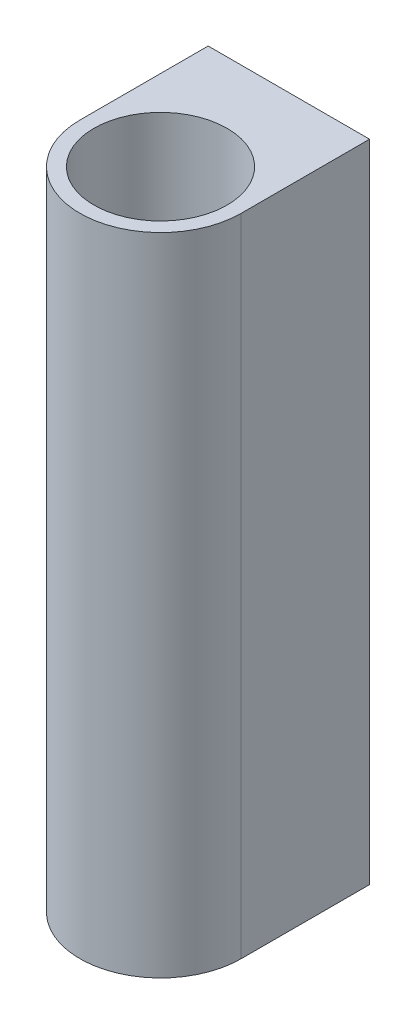
ISO-10303-21;
HEADER;
FILE_DESCRIPTION(('STEP AP214'),'2;1');
FILE_NAME('part.step','',(''),(''),'','','');
FILE_SCHEMA(('AUTOMOTIVE_DESIGN { 1 0 10303 214 1 1 1 1 }'));
ENDSEC;
DATA;
#1=APPLICATION_CONTEXT('core data for automotive mechanical design processes');
#2=APPLICATION_PROTOCOL_DEFINITION('international standard','automotive_design',2000,#1);
#3=PRODUCT_CONTEXT('',#1,'mechanical');
#4=PRODUCT('Part','Part','',(#3));
#5=PRODUCT_RELATED_PRODUCT_CATEGORY('part','',(#4));
#6=PRODUCT_DEFINITION_FORMATION('','',#4);
#7=PRODUCT_DEFINITION_CONTEXT('part definition',#1,'design');
#8=PRODUCT_DEFINITION('design','',#6,#7);
#9=PRODUCT_DEFINITION_SHAPE('','',#8);
#10=(LENGTH_UNIT() NAMED_UNIT(*) SI_UNIT(.MILLI.,.METRE.));
#11=(NAMED_UNIT(*) PLANE_ANGLE_UNIT() SI_UNIT($,.RADIAN.));
#12=(NAMED_UNIT(*) SI_UNIT($,.STERADIAN.) SOLID_ANGLE_UNIT());
#13=UNCERTAINTY_MEASURE_WITH_UNIT(LENGTH_MEASURE(1.E-05),#10,'distance_accuracy_value','');
#14=(GEOMETRIC_REPRESENTATION_CONTEXT(3) GLOBAL_UNCERTAINTY_ASSIGNED_CONTEXT((#13)) GLOBAL_UNIT_ASSIGNED_CONTEXT((#10,
#11,#12)) REPRESENTATION_CONTEXT('',''));
#15=CARTESIAN_POINT('',(0.,0.,0.));
#16=DIRECTION('',(0.,0.,1.));
#17=DIRECTION('',(1.,0.,0.));
#18=AXIS2_PLACEMENT_3D('',#15,#16,#17);
#19=CARTESIAN_POINT('',(0.,0.,0.));
#20=DIRECTION('',(0.,-1.,0.));
#21=DIRECTION('',(0.,0.,-1.));
#22=AXIS2_PLACEMENT_3D('',#19,#20,#21);
#23=CYLINDRICAL_SURFACE('',#22,25.3999999938142);
#24=DIRECTION('',(0.,-1.,0.));
#25=VECTOR('',#24,1.);
#26=CARTESIAN_POINT('',(25.3999999937946,268.106085987624,0.));
#27=LINE('',#26,#25);
#28=CARTESIAN_POINT('',(25.3999999937946,203.199999999963,0.));
#29=VERTEX_POINT('',#28);
#30=CARTESIAN_POINT('',(25.3999999937946,3.11380453483725E-11,0.));
#31=VERTEX_POINT('',#30);
#32=EDGE_CURVE('E107',#29,#31,#27,.T.);
#33=ORIENTED_EDGE('',*,*,#32,.F.);
#34=CARTESIAN_POINT('',(0.,203.199999999963,0.));
#35=DIRECTION('',(0.,-1.,0.));
#36=DIRECTION('',(0.,0.,-1.));
#37=AXIS2_PLACEMENT_3D('',#34,#35,#36);
#38=CIRCLE('',#37,25.3999999938337);
#39=CARTESIAN_POINT('',(-25.3999999937946,203.199999999963,0.));
#40=VERTEX_POINT('',#39);
#41=EDGE_CURVE('E46',#29,#40,#38,.T.);
#42=ORIENTED_EDGE('',*,*,#41,.T.);
#43=DIRECTION('',(0.,-1.,0.));
#44=VECTOR('',#43,1.);
#45=CARTESIAN_POINT('',(-25.3999999937946,268.106085987624,0.));
#46=LINE('',#45,#44);
#47=CARTESIAN_POINT('',(-25.3999999937946,3.11380453483725E-11,0.));
#48=VERTEX_POINT('',#47);
#49=EDGE_CURVE('E53',#40,#48,#46,.T.);
#50=ORIENTED_EDGE('',*,*,#49,.T.);
#51=CARTESIAN_POINT('',(0.,3.11380453483725E-11,0.));
#52=DIRECTION('',(0.,-1.,0.));
#53=DIRECTION('',(0.,0.,-1.));
#54=AXIS2_PLACEMENT_3D('',#51,#52,#53);
#55=CIRCLE('',#54,25.3999999937946);
#56=EDGE_CURVE('E11',#31,#48,#55,.T.);
#57=ORIENTED_EDGE('',*,*,#56,.F.);
#58=EDGE_LOOP('',(#33,#42,#50,#57));
#59=FACE_BOUND('',#58,.T.);
#60=ADVANCED_FACE('F38',(#59),#23,.T.);
#61=CARTESIAN_POINT('',(-20.955,3.11393374928046E-11,0.));
#62=DIRECTION('',(0.,1.,0.));
#63=DIRECTION('',(0.,0.,1.));
#64=AXIS2_PLACEMENT_3D('',#61,#62,#63);
#65=PLANE('',#64);
#66=CARTESIAN_POINT('',(0.,3.11406296372367E-11,0.));
#67=DIRECTION('',(0.,-1.,0.));
#68=DIRECTION('',(0.,0.,-1.));
#69=AXIS2_PLACEMENT_3D('',#66,#67,#68);
#70=CIRCLE('',#69,20.955);
#71=CARTESIAN_POINT('',(0.,3.11406296372367E-11,-20.955));
#72=VERTEX_POINT('',#71);
#73=EDGE_CURVE('E113',#72,#72,#70,.T.);
#74=ORIENTED_EDGE('',*,*,#73,.F.);
#75=EDGE_LOOP('',(#74));
#76=FACE_BOUND('',#75,.T.);
#77=ORIENTED_EDGE('',*,*,#56,.T.);
#78=DIRECTION('',(0.,0.,-1.));
#79=VECTOR('',#78,1.);
#80=CARTESIAN_POINT('',(-25.3999999937946,0.,0.));
#81=LINE('',#80,#79);
#82=CARTESIAN_POINT('',(-25.3999999937946,0.,-40.3999999937946));
#83=VERTEX_POINT('',#82);
#84=EDGE_CURVE('E81',#48,#83,#81,.T.);
#85=ORIENTED_EDGE('',*,*,#84,.T.);
#86=DIRECTION('',(-1.,0.,0.));
#87=VECTOR('',#86,1.);
#88=CARTESIAN_POINT('',(0.,0.,-40.3999999937946));
#89=LINE('',#88,#87);
#90=CARTESIAN_POINT('',(25.3999999937946,0.,-40.3999999937946));
#91=VERTEX_POINT('',#90);
#92=EDGE_CURVE('E89',#91,#83,#89,.T.);
#93=ORIENTED_EDGE('',*,*,#92,.F.);
#94=DIRECTION('',(0.,0.,-1.));
#95=VECTOR('',#94,1.);
#96=CARTESIAN_POINT('',(25.3999999937946,0.,0.));
#97=LINE('',#96,#95);
#98=EDGE_CURVE('E95',#31,#91,#97,.T.);
#99=ORIENTED_EDGE('',*,*,#98,.F.);
#100=EDGE_LOOP('',(#77,#85,#93,#99));
#101=FACE_BOUND('',#100,.T.);
#102=ADVANCED_FACE('F40',(#76,#101),#65,.F.);
#103=CARTESIAN_POINT('',(-20.9550000000491,203.199999999963,0.));
#104=DIRECTION('',(0.,-1.,0.));
#105=DIRECTION('',(0.,0.,-1.));
#106=AXIS2_PLACEMENT_3D('',#103,#104,#105);
#107=PLANE('',#106);
#108=ORIENTED_EDGE('',*,*,#41,.F.);
#109=DIRECTION('',(0.,0.,1.));
#110=VECTOR('',#109,1.);
#111=CARTESIAN_POINT('',(25.3999999937946,203.199999999963,0.));
#112=LINE('',#111,#110);
#113=CARTESIAN_POINT('',(25.3999999937946,203.199999999963,-40.3999999937946));
#114=VERTEX_POINT('',#113);
#115=EDGE_CURVE('E103',#114,#29,#112,.T.);
#116=ORIENTED_EDGE('',*,*,#115,.F.);
#117=DIRECTION('',(1.,0.,0.));
#118=VECTOR('',#117,1.);
#119=CARTESIAN_POINT('',(0.,203.199999999963,-40.3999999937946));
#120=LINE('',#119,#118);
#121=CARTESIAN_POINT('',(-25.3999999937946,203.199999999963,-40.3999999937946));
#122=VERTEX_POINT('',#121);
#123=EDGE_CURVE('E109',#122,#114,#120,.T.);
#124=ORIENTED_EDGE('',*,*,#123,.F.);
#125=DIRECTION('',(0.,0.,1.));
#126=VECTOR('',#125,1.);
#127=CARTESIAN_POINT('',(-25.3999999937946,203.199999999963,0.));
#128=LINE('',#127,#126);
#129=EDGE_CURVE('E83',#122,#40,#128,.T.);
#130=ORIENTED_EDGE('',*,*,#129,.T.);
#131=EDGE_LOOP('',(#108,#116,#124,#130));
#132=FACE_BOUND('',#131,.T.);
#133=CARTESIAN_POINT('',(0.,203.199999999963,0.));
#134=DIRECTION('',(0.,-1.,0.));
#135=DIRECTION('',(0.,0.,-1.));
#136=AXIS2_PLACEMENT_3D('',#133,#134,#135);
#137=CIRCLE('',#136,20.9550000000491);
#138=CARTESIAN_POINT('',(0.,203.199999999963,-20.9550000000491));
#139=VERTEX_POINT('',#138);
#140=EDGE_CURVE('E128',#139,#139,#137,.T.);
#141=ORIENTED_EDGE('',*,*,#140,.T.);
#142=EDGE_LOOP('',(#141));
#143=FACE_BOUND('',#142,.T.);
#144=ADVANCED_FACE('F132',(#132,#143),#107,.F.);
#145=CARTESIAN_POINT('',(0.,0.,0.));
#146=DIRECTION('',(0.,-1.,0.));
#147=DIRECTION('',(0.,0.,-1.));
#148=AXIS2_PLACEMENT_3D('',#145,#146,#147);
#149=CYLINDRICAL_SURFACE('',#148,20.9550000000491);
#150=ORIENTED_EDGE('',*,*,#140,.F.);
#151=EDGE_LOOP('',(#150));
#152=FACE_BOUND('',#151,.T.);
#153=CARTESIAN_POINT('',(0.,165.099999999963,0.));
#154=DIRECTION('',(0.,-1.,0.));
#155=DIRECTION('',(0.,0.,-1.));
#156=AXIS2_PLACEMENT_3D('',#153,#154,#155);
#157=CIRCLE('',#156,20.9550000000491);
#158=CARTESIAN_POINT('',(0.,165.099999999963,-20.9550000000491));
#159=VERTEX_POINT('',#158);
#160=EDGE_CURVE('E125',#159,#159,#157,.T.);
#161=ORIENTED_EDGE('',*,*,#160,.T.);
#162=EDGE_LOOP('',(#161));
#163=FACE_BOUND('',#162,.T.);
#164=ADVANCED_FACE('F175',(#152,#163),#149,.F.);
#165=CARTESIAN_POINT('',(-19.177000000049,165.099999999963,0.));
#166=DIRECTION('',(0.,-1.,0.));
#167=DIRECTION('',(0.,0.,-1.));
#168=AXIS2_PLACEMENT_3D('',#165,#166,#167);
#169=PLANE('',#168);
#170=ORIENTED_EDGE('',*,*,#160,.F.);
#171=EDGE_LOOP('',(#170));
#172=FACE_BOUND('',#171,.T.);
#173=CARTESIAN_POINT('',(0.,165.099999999963,0.));
#174=DIRECTION('',(0.,-1.,0.));
#175=DIRECTION('',(0.,0.,-1.));
#176=AXIS2_PLACEMENT_3D('',#173,#174,#175);
#177=CIRCLE('',#176,19.177000000049);
#178=CARTESIAN_POINT('',(0.,165.099999999963,-19.177000000049));
#179=VERTEX_POINT('',#178);
#180=EDGE_CURVE('E122',#179,#179,#177,.T.);
#181=ORIENTED_EDGE('',*,*,#180,.T.);
#182=EDGE_LOOP('',(#181));
#183=FACE_BOUND('',#182,.T.);
#184=ADVANCED_FACE('F178',(#172,#183),#169,.F.);
#185=CARTESIAN_POINT('',(0.,0.,0.));
#186=DIRECTION('',(0.,-1.,0.));
#187=DIRECTION('',(0.,0.,-1.));
#188=AXIS2_PLACEMENT_3D('',#185,#186,#187);
#189=CYLINDRICAL_SURFACE('',#188,19.177000000049);
#190=ORIENTED_EDGE('',*,*,#180,.F.);
#191=EDGE_LOOP('',(#190));
#192=FACE_BOUND('',#191,.T.);
#193=CARTESIAN_POINT('',(0.,38.0999999999633,0.));
#194=DIRECTION('',(0.,-1.,0.));
#195=DIRECTION('',(0.,0.,-1.));
#196=AXIS2_PLACEMENT_3D('',#193,#194,#195);
#197=CIRCLE('',#196,19.177000000049);
#198=CARTESIAN_POINT('',(0.,38.0999999999633,-19.177000000049));
#199=VERTEX_POINT('',#198);
#200=EDGE_CURVE('E119',#199,#199,#197,.T.);
#201=ORIENTED_EDGE('',*,*,#200,.T.);
#202=EDGE_LOOP('',(#201));
#203=FACE_BOUND('',#202,.T.);
#204=ADVANCED_FACE('F182',(#192,#203),#189,.F.);
#205=CARTESIAN_POINT('',(-20.955,38.0999999999972,0.));
#206=DIRECTION('',(0.,1.,0.));
#207=DIRECTION('',(0.,0.,1.));
#208=AXIS2_PLACEMENT_3D('',#205,#206,#207);
#209=PLANE('',#208);
#210=ORIENTED_EDGE('',*,*,#200,.F.);
#211=EDGE_LOOP('',(#210));
#212=FACE_BOUND('',#211,.T.);
#213=CARTESIAN_POINT('',(0.,38.1000000000311,0.));
#214=DIRECTION('',(0.,-1.,0.));
#215=DIRECTION('',(0.,0.,-1.));
#216=AXIS2_PLACEMENT_3D('',#213,#214,#215);
#217=CIRCLE('',#216,20.955);
#218=CARTESIAN_POINT('',(0.,38.1000000000311,-20.955));
#219=VERTEX_POINT('',#218);
#220=EDGE_CURVE('E116',#219,#219,#217,.T.);
#221=ORIENTED_EDGE('',*,*,#220,.T.);
#222=EDGE_LOOP('',(#221));
#223=FACE_BOUND('',#222,.T.);
#224=ADVANCED_FACE('F186',(#212,#223),#209,.F.);
#225=CARTESIAN_POINT('',(0.,0.,0.));
#226=DIRECTION('',(0.,-1.,0.));
#227=DIRECTION('',(0.,0.,-1.));
#228=AXIS2_PLACEMENT_3D('',#225,#226,#227);
#229=CYLINDRICAL_SURFACE('',#228,20.955);
#230=ORIENTED_EDGE('',*,*,#220,.F.);
#231=EDGE_LOOP('',(#230));
#232=FACE_BOUND('',#231,.T.);
#233=ORIENTED_EDGE('',*,*,#73,.T.);
#234=EDGE_LOOP('',(#233));
#235=FACE_BOUND('',#234,.T.);
#236=ADVANCED_FACE('F190',(#232,#235),#229,.F.);
#237=CARTESIAN_POINT('',(25.3999999937946,268.106085987624,0.));
#238=DIRECTION('',(-1.,0.,0.));
#239=DIRECTION('',(0.,0.,1.));
#240=AXIS2_PLACEMENT_3D('',#237,#238,#239);
#241=PLANE('',#240);
#242=DIRECTION('',(0.,-1.,0.));
#243=VECTOR('',#242,1.);
#244=CARTESIAN_POINT('',(25.3999999937946,268.106085987624,-40.3999999937946));
#245=LINE('',#244,#243);
#246=EDGE_CURVE('E86',#114,#91,#245,.T.);
#247=ORIENTED_EDGE('',*,*,#246,.F.);
#248=ORIENTED_EDGE('',*,*,#115,.T.);
#249=ORIENTED_EDGE('',*,*,#32,.T.);
#250=ORIENTED_EDGE('',*,*,#98,.T.);
#251=EDGE_LOOP('',(#247,#248,#249,#250));
#252=FACE_BOUND('',#251,.T.);
#253=ADVANCED_FACE('F194',(#252),#241,.F.);
#254=CARTESIAN_POINT('',(0.,268.106085987624,-40.3999999937946));
#255=DIRECTION('',(0.,0.,1.));
#256=DIRECTION('',(1.,0.,0.));
#257=AXIS2_PLACEMENT_3D('',#254,#255,#256);
#258=PLANE('',#257);
#259=CARTESIAN_POINT('',(-12.6999999968973,30.,-40.3999999937946));
#260=DIRECTION('',(0.,0.,1.));
#261=DIRECTION('',(1.,0.,0.));
#262=AXIS2_PLACEMENT_3D('',#259,#260,#261);
#263=CIRCLE('',#262,5.);
#264=CARTESIAN_POINT('',(-7.6999999968973,30.,-40.3999999937946));
#265=VERTEX_POINT('',#264);
#266=EDGE_CURVE('E150',#265,#265,#263,.T.);
#267=ORIENTED_EDGE('',*,*,#266,.T.);
#268=EDGE_LOOP('',(#267));
#269=FACE_BOUND('',#268,.T.);
#270=CARTESIAN_POINT('',(-12.6999999968973,173.199999999963,-40.3999999937946));
#271=DIRECTION('',(0.,0.,1.));
#272=DIRECTION('',(1.,0.,0.));
#273=AXIS2_PLACEMENT_3D('',#270,#271,#272);
#274=CIRCLE('',#273,5.00000000000001);
#275=CARTESIAN_POINT('',(-7.6999999968973,173.199999999963,-40.3999999937946));
#276=VERTEX_POINT('',#275);
#277=EDGE_CURVE('E144',#276,#276,#274,.T.);
#278=ORIENTED_EDGE('',*,*,#277,.T.);
#279=EDGE_LOOP('',(#278));
#280=FACE_BOUND('',#279,.T.);
#281=CARTESIAN_POINT('',(12.6999999968973,30.,-40.3999999937946));
#282=DIRECTION('',(0.,0.,-1.));
#283=DIRECTION('',(-1.,0.,0.));
#284=AXIS2_PLACEMENT_3D('',#281,#282,#283);
#285=CIRCLE('',#284,5.);
#286=CARTESIAN_POINT('',(7.6999999968973,30.,-40.3999999937946));
#287=VERTEX_POINT('',#286);
#288=EDGE_CURVE('E100',#287,#287,#285,.T.);
#289=ORIENTED_EDGE('',*,*,#288,.F.);
#290=EDGE_LOOP('',(#289));
#291=FACE_BOUND('',#290,.T.);
#292=CARTESIAN_POINT('',(12.6999999968973,173.199999999963,-40.3999999937946));
#293=DIRECTION('',(0.,0.,-1.));
#294=DIRECTION('',(-1.,0.,0.));
#295=AXIS2_PLACEMENT_3D('',#292,#293,#294);
#296=CIRCLE('',#295,5.00000000000001);
#297=CARTESIAN_POINT('',(7.6999999968973,173.199999999963,-40.3999999937946));
#298=VERTEX_POINT('',#297);
#299=EDGE_CURVE('E135',#298,#298,#296,.T.);
#300=ORIENTED_EDGE('',*,*,#299,.F.);
#301=EDGE_LOOP('',(#300));
#302=FACE_BOUND('',#301,.T.);
#303=DIRECTION('',(0.,-1.,0.));
#304=VECTOR('',#303,1.);
#305=CARTESIAN_POINT('',(-25.3999999937946,268.106085987624,-40.3999999937946));
#306=LINE('',#305,#304);
#307=EDGE_CURVE('E77',#122,#83,#306,.T.);
#308=ORIENTED_EDGE('',*,*,#307,.F.);
#309=ORIENTED_EDGE('',*,*,#123,.T.);
#310=ORIENTED_EDGE('',*,*,#246,.T.);
#311=ORIENTED_EDGE('',*,*,#92,.T.);
#312=EDGE_LOOP('',(#308,#309,#310,#311));
#313=FACE_BOUND('',#312,.T.);
#314=ADVANCED_FACE('F90',(#269,#280,#291,#302,#313),#258,.F.);
#315=CARTESIAN_POINT('',(-25.3999999937946,268.106085987624,0.));
#316=DIRECTION('',(-1.,0.,0.));
#317=DIRECTION('',(0.,0.,1.));
#318=AXIS2_PLACEMENT_3D('',#315,#316,#317);
#319=PLANE('',#318);
#320=ORIENTED_EDGE('',*,*,#129,.F.);
#321=ORIENTED_EDGE('',*,*,#307,.T.);
#322=ORIENTED_EDGE('',*,*,#84,.F.);
#323=ORIENTED_EDGE('',*,*,#49,.F.);
#324=EDGE_LOOP('',(#320,#321,#322,#323));
#325=FACE_BOUND('',#324,.T.);
#326=ADVANCED_FACE('F79',(#325),#319,.T.);
#327=CARTESIAN_POINT('',(12.6999999968973,173.199999999963,-25.3999999937946));
#328=DIRECTION('',(0.,0.,-1.));
#329=DIRECTION('',(-1.,0.,0.));
#330=AXIS2_PLACEMENT_3D('',#327,#328,#329);
#331=CYLINDRICAL_SURFACE('',#330,5.00000000000001);
#332=CARTESIAN_POINT('',(12.6999999968973,173.199999999963,-25.3999999937946));
#333=DIRECTION('',(0.,0.,-1.));
#334=DIRECTION('',(-1.,0.,0.));
#335=AXIS2_PLACEMENT_3D('',#332,#333,#334);
#336=CIRCLE('',#335,5.00000000000001);
#337=CARTESIAN_POINT('',(7.6999999968973,173.199999999963,-25.3999999937946));
#338=VERTEX_POINT('',#337);
#339=EDGE_CURVE('E138',#338,#338,#336,.T.);
#340=ORIENTED_EDGE('',*,*,#339,.F.);
#341=EDGE_LOOP('',(#340));
#342=FACE_BOUND('',#341,.T.);
#343=ORIENTED_EDGE('',*,*,#299,.T.);
#344=EDGE_LOOP('',(#343));
#345=FACE_BOUND('',#344,.T.);
#346=ADVANCED_FACE('F198',(#342,#345),#331,.F.);
#347=CARTESIAN_POINT('',(12.6999999968973,173.199999999963,-25.3999999937946));
#348=DIRECTION('',(0.,0.,-1.));
#349=DIRECTION('',(-1.,0.,0.));
#350=AXIS2_PLACEMENT_3D('',#347,#348,#349);
#351=PLANE('',#350);
#352=ORIENTED_EDGE('',*,*,#339,.T.);
#353=EDGE_LOOP('',(#352));
#354=FACE_BOUND('',#353,.T.);
#355=ADVANCED_FACE('F207',(#354),#351,.T.);
#356=CARTESIAN_POINT('',(12.6999999968973,30.,-25.3999999937946));
#357=DIRECTION('',(0.,0.,-1.));
#358=DIRECTION('',(-1.,0.,0.));
#359=AXIS2_PLACEMENT_3D('',#356,#357,#358);
#360=CYLINDRICAL_SURFACE('',#359,5.);
#361=CARTESIAN_POINT('',(12.6999999968973,30.,-25.3999999937946));
#362=DIRECTION('',(0.,0.,-1.));
#363=DIRECTION('',(-1.,0.,0.));
#364=AXIS2_PLACEMENT_3D('',#361,#362,#363);
#365=CIRCLE('',#364,5.);
#366=CARTESIAN_POINT('',(7.6999999968973,30.,-25.3999999937946));
#367=VERTEX_POINT('',#366);
#368=EDGE_CURVE('E97',#367,#367,#365,.T.);
#369=ORIENTED_EDGE('',*,*,#368,.F.);
#370=EDGE_LOOP('',(#369));
#371=FACE_BOUND('',#370,.T.);
#372=ORIENTED_EDGE('',*,*,#288,.T.);
#373=EDGE_LOOP('',(#372));
#374=FACE_BOUND('',#373,.T.);
#375=ADVANCED_FACE('F211',(#371,#374),#360,.F.);
#376=CARTESIAN_POINT('',(12.6999999968973,30.,-25.3999999937946));
#377=DIRECTION('',(0.,0.,-1.));
#378=DIRECTION('',(-1.,0.,0.));
#379=AXIS2_PLACEMENT_3D('',#376,#377,#378);
#380=PLANE('',#379);
#381=ORIENTED_EDGE('',*,*,#368,.T.);
#382=EDGE_LOOP('',(#381));
#383=FACE_BOUND('',#382,.T.);
#384=ADVANCED_FACE('F215',(#383),#380,.T.);
#385=CARTESIAN_POINT('',(-12.6999999968973,173.199999999963,-25.3999999937946));
#386=DIRECTION('',(0.,0.,-1.));
#387=DIRECTION('',(-1.,0.,0.));
#388=AXIS2_PLACEMENT_3D('',#385,#386,#387);
#389=CYLINDRICAL_SURFACE('',#388,5.00000000000001);
#390=CARTESIAN_POINT('',(-12.6999999968973,173.199999999963,-25.3999999937946));
#391=DIRECTION('',(0.,0.,1.));
#392=DIRECTION('',(1.,0.,0.));
#393=AXIS2_PLACEMENT_3D('',#390,#391,#392);
#394=CIRCLE('',#393,5.00000000000001);
#395=CARTESIAN_POINT('',(-7.6999999968973,173.199999999963,-25.3999999937946));
#396=VERTEX_POINT('',#395);
#397=EDGE_CURVE('E147',#396,#396,#394,.T.);
#398=ORIENTED_EDGE('',*,*,#397,.T.);
#399=EDGE_LOOP('',(#398));
#400=FACE_BOUND('',#399,.T.);
#401=ORIENTED_EDGE('',*,*,#277,.F.);
#402=EDGE_LOOP('',(#401));
#403=FACE_BOUND('',#402,.T.);
#404=ADVANCED_FACE('F219',(#400,#403),#389,.F.);
#405=CARTESIAN_POINT('',(-12.6999999968973,173.199999999963,-25.3999999937946));
#406=DIRECTION('',(0.,0.,-1.));
#407=DIRECTION('',(1.,0.,0.));
#408=AXIS2_PLACEMENT_3D('',#405,#406,#407);
#409=PLANE('',#408);
#410=ORIENTED_EDGE('',*,*,#397,.F.);
#411=EDGE_LOOP('',(#410));
#412=FACE_BOUND('',#411,.T.);
#413=ADVANCED_FACE('F165',(#412),#409,.T.);
#414=CARTESIAN_POINT('',(-12.6999999968973,30.,-25.3999999937946));
#415=DIRECTION('',(0.,0.,-1.));
#416=DIRECTION('',(-1.,0.,0.));
#417=AXIS2_PLACEMENT_3D('',#414,#415,#416);
#418=CYLINDRICAL_SURFACE('',#417,5.);
#419=CARTESIAN_POINT('',(-12.6999999968973,30.,-25.3999999937946));
#420=DIRECTION('',(0.,0.,1.));
#421=DIRECTION('',(1.,0.,0.));
#422=AXIS2_PLACEMENT_3D('',#419,#420,#421);
#423=CIRCLE('',#422,5.);
#424=CARTESIAN_POINT('',(-7.6999999968973,30.,-25.3999999937946));
#425=VERTEX_POINT('',#424);
#426=EDGE_CURVE('E139',#425,#425,#423,.T.);
#427=ORIENTED_EDGE('',*,*,#426,.T.);
#428=EDGE_LOOP('',(#427));
#429=FACE_BOUND('',#428,.T.);
#430=ORIENTED_EDGE('',*,*,#266,.F.);
#431=EDGE_LOOP('',(#430));
#432=FACE_BOUND('',#431,.T.);
#433=ADVANCED_FACE('F156',(#429,#432),#418,.F.);
#434=CARTESIAN_POINT('',(-12.6999999968973,30.,-25.3999999937946));
#435=DIRECTION('',(0.,0.,-1.));
#436=DIRECTION('',(1.,0.,0.));
#437=AXIS2_PLACEMENT_3D('',#434,#435,#436);
#438=PLANE('',#437);
#439=ORIENTED_EDGE('',*,*,#426,.F.);
#440=EDGE_LOOP('',(#439));
#441=FACE_BOUND('',#440,.T.);
#442=ADVANCED_FACE('F159',(#441),#438,.T.);
#443=CLOSED_SHELL('',(#60,#102,#144,#164,#184,#204,#224,#236,#253,#314,#326,#346,#355,#375,#384,
#404,#413,#433,#442));
#444=MANIFOLD_SOLID_BREP('B2',#443);
#445=ADVANCED_BREP_SHAPE_REPRESENTATION('',(#18,#444),#14);
#446=SHAPE_DEFINITION_REPRESENTATION(#9,#445);
ENDSEC;
END-ISO-10303-21;
